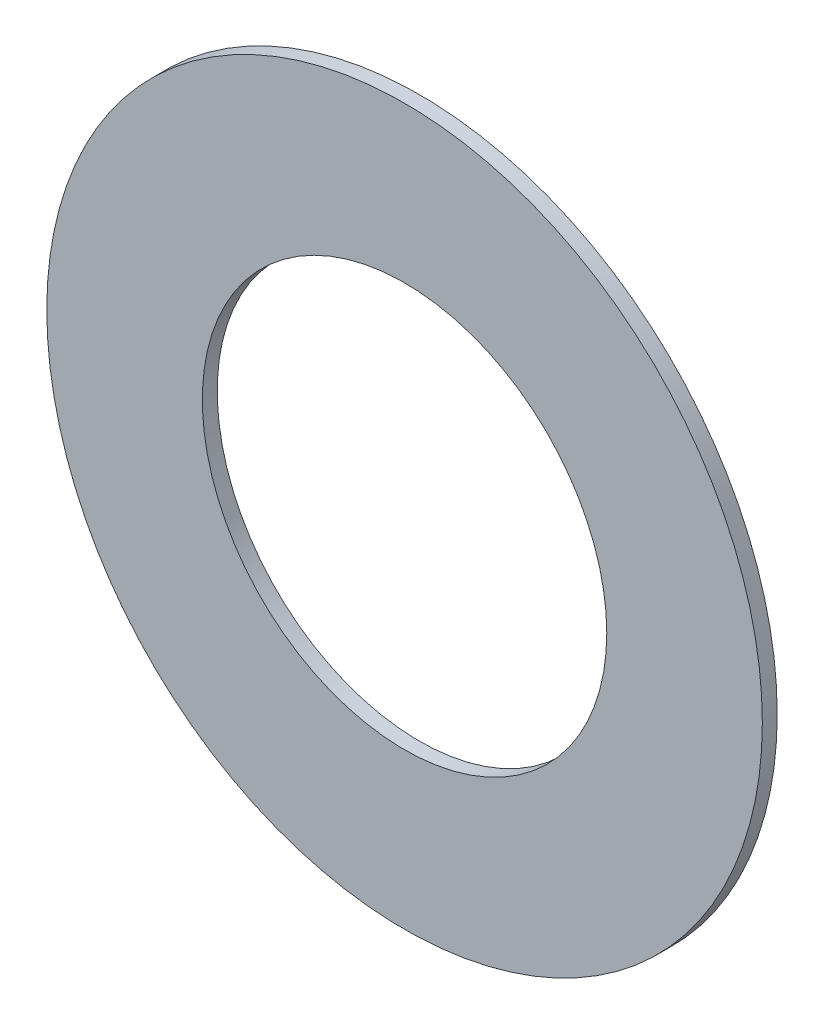
ISO-10303-21;
HEADER;
FILE_DESCRIPTION(('STEP AP214'),'2;1');
FILE_NAME('part.step','',(''),(''),'','','');
FILE_SCHEMA(('AUTOMOTIVE_DESIGN { 1 0 10303 214 1 1 1 1 }'));
ENDSEC;
DATA;
#1=APPLICATION_CONTEXT('core data for automotive mechanical design processes');
#2=APPLICATION_PROTOCOL_DEFINITION('international standard','automotive_design',2000,#1);
#3=PRODUCT_CONTEXT('',#1,'mechanical');
#4=PRODUCT('Part','Part','',(#3));
#5=PRODUCT_RELATED_PRODUCT_CATEGORY('part','',(#4));
#6=PRODUCT_DEFINITION_FORMATION('','',#4);
#7=PRODUCT_DEFINITION_CONTEXT('part definition',#1,'design');
#8=PRODUCT_DEFINITION('design','',#6,#7);
#9=PRODUCT_DEFINITION_SHAPE('','',#8);
#10=(LENGTH_UNIT() NAMED_UNIT(*) SI_UNIT(.MILLI.,.METRE.));
#11=(NAMED_UNIT(*) PLANE_ANGLE_UNIT() SI_UNIT($,.RADIAN.));
#12=(NAMED_UNIT(*) SI_UNIT($,.STERADIAN.) SOLID_ANGLE_UNIT());
#13=UNCERTAINTY_MEASURE_WITH_UNIT(LENGTH_MEASURE(1.E-05),#10,'distance_accuracy_value','');
#14=(GEOMETRIC_REPRESENTATION_CONTEXT(3) GLOBAL_UNCERTAINTY_ASSIGNED_CONTEXT((#13)) GLOBAL_UNIT_ASSIGNED_CONTEXT((#10,
#11,#12)) REPRESENTATION_CONTEXT('',''));
#15=CARTESIAN_POINT('',(0.,0.,0.));
#16=DIRECTION('',(0.,0.,1.));
#17=DIRECTION('',(1.,0.,0.));
#18=AXIS2_PLACEMENT_3D('',#15,#16,#17);
#19=CARTESIAN_POINT('',(0.,0.,1.51892));
#20=DIRECTION('',(0.,0.,1.));
#21=DIRECTION('',(1.,0.,0.));
#22=AXIS2_PLACEMENT_3D('',#19,#20,#21);
#23=PLANE('',#22);
#24=CARTESIAN_POINT('',(0.,0.,1.51892));
#25=DIRECTION('',(0.,0.,1.));
#26=DIRECTION('',(1.,0.,0.));
#27=AXIS2_PLACEMENT_3D('',#24,#25,#26);
#28=CIRCLE('',#27,36.5125);
#29=CARTESIAN_POINT('',(36.5125,0.,1.51892));
#30=VERTEX_POINT('',#29);
#31=EDGE_CURVE('E10',#30,#30,#28,.T.);
#32=ORIENTED_EDGE('',*,*,#31,.T.);
#33=EDGE_LOOP('',(#32));
#34=FACE_BOUND('',#33,.T.);
#35=CARTESIAN_POINT('',(0.,0.,1.51892));
#36=DIRECTION('',(0.,0.,1.));
#37=DIRECTION('',(1.,0.,0.));
#38=AXIS2_PLACEMENT_3D('',#35,#36,#37);
#39=CIRCLE('',#38,20.6375);
#40=CARTESIAN_POINT('',(20.6375,0.,1.51892));
#41=VERTEX_POINT('',#40);
#42=EDGE_CURVE('E41',#41,#41,#39,.T.);
#43=ORIENTED_EDGE('',*,*,#42,.F.);
#44=EDGE_LOOP('',(#43));
#45=FACE_BOUND('',#44,.T.);
#46=ADVANCED_FACE('F30',(#34,#45),#23,.T.);
#47=CARTESIAN_POINT('',(0.,0.,0.));
#48=DIRECTION('',(0.,0.,1.));
#49=DIRECTION('',(1.,0.,0.));
#50=AXIS2_PLACEMENT_3D('',#47,#48,#49);
#51=PLANE('',#50);
#52=CARTESIAN_POINT('',(0.,0.,0.));
#53=DIRECTION('',(0.,0.,1.));
#54=DIRECTION('',(1.,0.,0.));
#55=AXIS2_PLACEMENT_3D('',#52,#53,#54);
#56=CIRCLE('',#55,36.5125);
#57=CARTESIAN_POINT('',(36.5125,0.,0.));
#58=VERTEX_POINT('',#57);
#59=EDGE_CURVE('E34',#58,#58,#56,.T.);
#60=ORIENTED_EDGE('',*,*,#59,.F.);
#61=EDGE_LOOP('',(#60));
#62=FACE_BOUND('',#61,.T.);
#63=CARTESIAN_POINT('',(0.,0.,0.));
#64=DIRECTION('',(0.,0.,1.));
#65=DIRECTION('',(1.,0.,0.));
#66=AXIS2_PLACEMENT_3D('',#63,#64,#65);
#67=CIRCLE('',#66,20.6375);
#68=CARTESIAN_POINT('',(20.6375,0.,0.));
#69=VERTEX_POINT('',#68);
#70=EDGE_CURVE('E43',#69,#69,#67,.T.);
#71=ORIENTED_EDGE('',*,*,#70,.T.);
#72=EDGE_LOOP('',(#71));
#73=FACE_BOUND('',#72,.T.);
#74=ADVANCED_FACE('F53',(#62,#73),#51,.F.);
#75=CARTESIAN_POINT('',(0.,0.,1.51892));
#76=DIRECTION('',(0.,0.,-1.));
#77=DIRECTION('',(-1.,0.,0.));
#78=AXIS2_PLACEMENT_3D('',#75,#76,#77);
#79=CYLINDRICAL_SURFACE('',#78,36.5125);
#80=ORIENTED_EDGE('',*,*,#31,.F.);
#81=EDGE_LOOP('',(#80));
#82=FACE_BOUND('',#81,.T.);
#83=ORIENTED_EDGE('',*,*,#59,.T.);
#84=EDGE_LOOP('',(#83));
#85=FACE_BOUND('',#84,.T.);
#86=ADVANCED_FACE('F32',(#82,#85),#79,.T.);
#87=CARTESIAN_POINT('',(0.,0.,1.51892));
#88=DIRECTION('',(0.,0.,-1.));
#89=DIRECTION('',(-1.,0.,0.));
#90=AXIS2_PLACEMENT_3D('',#87,#88,#89);
#91=CYLINDRICAL_SURFACE('',#90,20.6375);
#92=ORIENTED_EDGE('',*,*,#42,.T.);
#93=EDGE_LOOP('',(#92));
#94=FACE_BOUND('',#93,.T.);
#95=ORIENTED_EDGE('',*,*,#70,.F.);
#96=EDGE_LOOP('',(#95));
#97=FACE_BOUND('',#96,.T.);
#98=ADVANCED_FACE('F49',(#94,#97),#91,.F.);
#99=CLOSED_SHELL('',(#46,#74,#86,#98));
#100=MANIFOLD_SOLID_BREP('B2',#99);
#101=ADVANCED_BREP_SHAPE_REPRESENTATION('',(#18,#100),#14);
#102=SHAPE_DEFINITION_REPRESENTATION(#9,#101);
ENDSEC;
END-ISO-10303-21;
